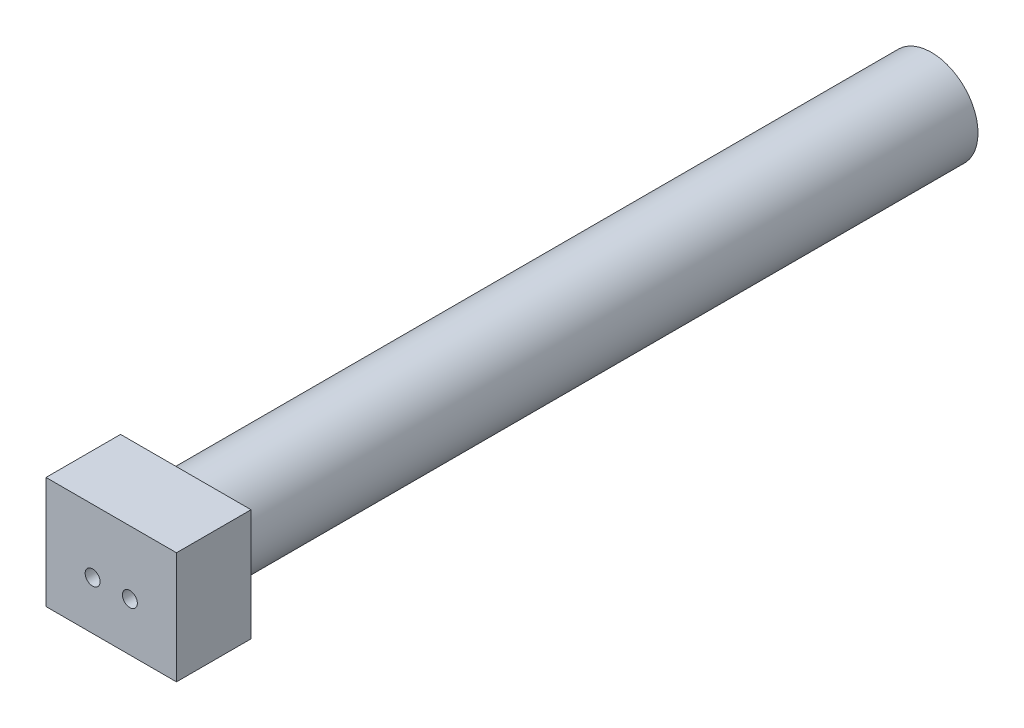
ISO-10303-21;
HEADER;
FILE_DESCRIPTION(('STEP AP214'),'2;1');
FILE_NAME('part.step','',(''),(''),'','','');
FILE_SCHEMA(('AUTOMOTIVE_DESIGN { 1 0 10303 214 1 1 1 1 }'));
ENDSEC;
DATA;
#1=APPLICATION_CONTEXT('core data for automotive mechanical design processes');
#2=APPLICATION_PROTOCOL_DEFINITION('international standard','automotive_design',2000,#1);
#3=PRODUCT_CONTEXT('',#1,'mechanical');
#4=PRODUCT('Part','Part','',(#3));
#5=PRODUCT_RELATED_PRODUCT_CATEGORY('part','',(#4));
#6=PRODUCT_DEFINITION_FORMATION('','',#4);
#7=PRODUCT_DEFINITION_CONTEXT('part definition',#1,'design');
#8=PRODUCT_DEFINITION('design','',#6,#7);
#9=PRODUCT_DEFINITION_SHAPE('','',#8);
#10=(LENGTH_UNIT() NAMED_UNIT(*) SI_UNIT(.MILLI.,.METRE.));
#11=(NAMED_UNIT(*) PLANE_ANGLE_UNIT() SI_UNIT($,.RADIAN.));
#12=(NAMED_UNIT(*) SI_UNIT($,.STERADIAN.) SOLID_ANGLE_UNIT());
#13=UNCERTAINTY_MEASURE_WITH_UNIT(LENGTH_MEASURE(1.E-05),#10,'distance_accuracy_value','');
#14=(GEOMETRIC_REPRESENTATION_CONTEXT(3) GLOBAL_UNCERTAINTY_ASSIGNED_CONTEXT((#13)) GLOBAL_UNIT_ASSIGNED_CONTEXT((#10,
#11,#12)) REPRESENTATION_CONTEXT('',''));
#15=CARTESIAN_POINT('',(0.,0.,0.));
#16=DIRECTION('',(0.,0.,1.));
#17=DIRECTION('',(1.,0.,0.));
#18=AXIS2_PLACEMENT_3D('',#15,#16,#17);
#19=CARTESIAN_POINT('',(0.,0.,0.));
#20=DIRECTION('',(0.,0.,1.));
#21=DIRECTION('',(1.,0.,0.));
#22=AXIS2_PLACEMENT_3D('',#19,#20,#21);
#23=PLANE('',#22);
#24=CARTESIAN_POINT('',(0.,0.,0.));
#25=DIRECTION('',(0.,0.,1.));
#26=DIRECTION('',(1.,0.,0.));
#27=AXIS2_PLACEMENT_3D('',#24,#25,#26);
#28=CIRCLE('',#27,12.5);
#29=CARTESIAN_POINT('',(12.5,0.,0.));
#30=VERTEX_POINT('',#29);
#31=EDGE_CURVE('E38',#30,#30,#28,.T.);
#32=ORIENTED_EDGE('',*,*,#31,.F.);
#33=EDGE_LOOP('',(#32));
#34=FACE_BOUND('',#33,.T.);
#35=CARTESIAN_POINT('',(0.,0.,0.));
#36=DIRECTION('',(0.,0.,1.));
#37=DIRECTION('',(1.,0.,0.));
#38=AXIS2_PLACEMENT_3D('',#35,#36,#37);
#39=CIRCLE('',#38,8.);
#40=CARTESIAN_POINT('',(8.,0.,0.));
#41=VERTEX_POINT('',#40);
#42=EDGE_CURVE('E115',#41,#41,#39,.T.);
#43=ORIENTED_EDGE('',*,*,#42,.T.);
#44=EDGE_LOOP('',(#43));
#45=FACE_BOUND('',#44,.T.);
#46=ADVANCED_FACE('F34',(#34,#45),#23,.F.);
#47=CARTESIAN_POINT('',(0.,0.,200.));
#48=DIRECTION('',(0.,0.,-1.));
#49=DIRECTION('',(-1.,0.,0.));
#50=AXIS2_PLACEMENT_3D('',#47,#48,#49);
#51=CYLINDRICAL_SURFACE('',#50,12.5);
#52=CARTESIAN_POINT('',(0.,0.,200.));
#53=DIRECTION('',(0.,0.,1.));
#54=DIRECTION('',(1.,0.,0.));
#55=AXIS2_PLACEMENT_3D('',#52,#53,#54);
#56=CIRCLE('',#55,12.5);
#57=CARTESIAN_POINT('',(12.5,0.,200.));
#58=VERTEX_POINT('',#57);
#59=EDGE_CURVE('E11',#58,#58,#56,.T.);
#60=ORIENTED_EDGE('',*,*,#59,.F.);
#61=EDGE_LOOP('',(#60));
#62=FACE_BOUND('',#61,.T.);
#63=ORIENTED_EDGE('',*,*,#31,.T.);
#64=EDGE_LOOP('',(#63));
#65=FACE_BOUND('',#64,.T.);
#66=ADVANCED_FACE('F36',(#62,#65),#51,.T.);
#67=CARTESIAN_POINT('',(0.,0.,200.));
#68=DIRECTION('',(0.,0.,-1.));
#69=DIRECTION('',(-1.,0.,0.));
#70=AXIS2_PLACEMENT_3D('',#67,#68,#69);
#71=CYLINDRICAL_SURFACE('',#70,8.);
#72=CARTESIAN_POINT('',(0.,0.,200.));
#73=DIRECTION('',(0.,0.,1.));
#74=DIRECTION('',(1.,0.,0.));
#75=AXIS2_PLACEMENT_3D('',#72,#73,#74);
#76=CIRCLE('',#75,8.);
#77=CARTESIAN_POINT('',(8.,0.,200.));
#78=VERTEX_POINT('',#77);
#79=EDGE_CURVE('E112',#78,#78,#76,.T.);
#80=ORIENTED_EDGE('',*,*,#79,.T.);
#81=EDGE_LOOP('',(#80));
#82=FACE_BOUND('',#81,.T.);
#83=ORIENTED_EDGE('',*,*,#42,.F.);
#84=EDGE_LOOP('',(#83));
#85=FACE_BOUND('',#84,.T.);
#86=ADVANCED_FACE('F127',(#82,#85),#71,.F.);
#87=CARTESIAN_POINT('',(0.,0.,200.));
#88=DIRECTION('',(0.,0.,1.));
#89=DIRECTION('',(1.,0.,0.));
#90=AXIS2_PLACEMENT_3D('',#87,#88,#89);
#91=PLANE('',#90);
#92=CARTESIAN_POINT('',(5.,-2.,200.));
#93=DIRECTION('',(0.,0.,1.));
#94=DIRECTION('',(1.,0.,0.));
#95=AXIS2_PLACEMENT_3D('',#92,#93,#94);
#96=CIRCLE('',#95,2.);
#97=CARTESIAN_POINT('',(7.,-2.,200.));
#98=VERTEX_POINT('',#97);
#99=EDGE_CURVE('E105',#98,#98,#96,.T.);
#100=ORIENTED_EDGE('',*,*,#99,.T.);
#101=EDGE_LOOP('',(#100));
#102=FACE_BOUND('',#101,.T.);
#103=CARTESIAN_POINT('',(-5.,-2.,200.));
#104=DIRECTION('',(0.,0.,1.));
#105=DIRECTION('',(1.,0.,0.));
#106=AXIS2_PLACEMENT_3D('',#103,#104,#105);
#107=CIRCLE('',#106,2.);
#108=CARTESIAN_POINT('',(-3.,-2.,200.));
#109=VERTEX_POINT('',#108);
#110=EDGE_CURVE('E167',#109,#109,#107,.T.);
#111=ORIENTED_EDGE('',*,*,#110,.T.);
#112=EDGE_LOOP('',(#111));
#113=FACE_BOUND('',#112,.T.);
#114=ORIENTED_EDGE('',*,*,#79,.F.);
#115=EDGE_LOOP('',(#114));
#116=FACE_BOUND('',#115,.T.);
#117=ADVANCED_FACE('F132',(#102,#113,#116),#91,.F.);
#118=CARTESIAN_POINT('',(-17.5,15.,220.));
#119=DIRECTION('',(1.,0.,0.));
#120=DIRECTION('',(0.,1.,0.));
#121=AXIS2_PLACEMENT_3D('',#118,#119,#120);
#122=PLANE('',#121);
#123=DIRECTION('',(0.,-1.,0.));
#124=VECTOR('',#123,1.);
#125=CARTESIAN_POINT('',(-17.5,15.,200.));
#126=LINE('',#125,#124);
#127=CARTESIAN_POINT('',(-17.5,15.,200.));
#128=VERTEX_POINT('',#127);
#129=CARTESIAN_POINT('',(-17.5,-15.,200.));
#130=VERTEX_POINT('',#129);
#131=EDGE_CURVE('E102',#128,#130,#126,.T.);
#132=ORIENTED_EDGE('',*,*,#131,.T.);
#133=DIRECTION('',(0.,0.,-1.));
#134=VECTOR('',#133,1.);
#135=CARTESIAN_POINT('',(-17.5,-15.,220.));
#136=LINE('',#135,#134);
#137=CARTESIAN_POINT('',(-17.5,-15.,220.));
#138=VERTEX_POINT('',#137);
#139=EDGE_CURVE('E93',#138,#130,#136,.T.);
#140=ORIENTED_EDGE('',*,*,#139,.F.);
#141=DIRECTION('',(0.,-1.,0.));
#142=VECTOR('',#141,1.);
#143=CARTESIAN_POINT('',(-17.5,15.,220.));
#144=LINE('',#143,#142);
#145=CARTESIAN_POINT('',(-17.5,15.,220.));
#146=VERTEX_POINT('',#145);
#147=EDGE_CURVE('E87',#146,#138,#144,.T.);
#148=ORIENTED_EDGE('',*,*,#147,.F.);
#149=DIRECTION('',(0.,0.,-1.));
#150=VECTOR('',#149,1.);
#151=CARTESIAN_POINT('',(-17.5,15.,220.));
#152=LINE('',#151,#150);
#153=EDGE_CURVE('E98',#146,#128,#152,.T.);
#154=ORIENTED_EDGE('',*,*,#153,.T.);
#155=EDGE_LOOP('',(#132,#140,#148,#154));
#156=FACE_BOUND('',#155,.T.);
#157=ADVANCED_FACE('F134',(#156),#122,.F.);
#158=CARTESIAN_POINT('',(-17.5,-15.,220.));
#159=DIRECTION('',(0.,1.,0.));
#160=DIRECTION('',(0.,0.,1.));
#161=AXIS2_PLACEMENT_3D('',#158,#159,#160);
#162=PLANE('',#161);
#163=DIRECTION('',(1.,0.,0.));
#164=VECTOR('',#163,1.);
#165=CARTESIAN_POINT('',(-17.5,-15.,200.));
#166=LINE('',#165,#164);
#167=CARTESIAN_POINT('',(17.5,-15.,200.));
#168=VERTEX_POINT('',#167);
#169=EDGE_CURVE('E92',#130,#168,#166,.T.);
#170=ORIENTED_EDGE('',*,*,#169,.T.);
#171=DIRECTION('',(0.,0.,-1.));
#172=VECTOR('',#171,1.);
#173=CARTESIAN_POINT('',(17.5,-15.,220.));
#174=LINE('',#173,#172);
#175=CARTESIAN_POINT('',(17.5,-15.,220.));
#176=VERTEX_POINT('',#175);
#177=EDGE_CURVE('E90',#176,#168,#174,.T.);
#178=ORIENTED_EDGE('',*,*,#177,.F.);
#179=DIRECTION('',(1.,0.,0.));
#180=VECTOR('',#179,1.);
#181=CARTESIAN_POINT('',(-17.5,-15.,220.));
#182=LINE('',#181,#180);
#183=EDGE_CURVE('E82',#138,#176,#182,.T.);
#184=ORIENTED_EDGE('',*,*,#183,.F.);
#185=ORIENTED_EDGE('',*,*,#139,.T.);
#186=EDGE_LOOP('',(#170,#178,#184,#185));
#187=FACE_BOUND('',#186,.T.);
#188=ADVANCED_FACE('F91',(#187),#162,.F.);
#189=CARTESIAN_POINT('',(17.5,15.,220.));
#190=DIRECTION('',(-1.,0.,0.));
#191=DIRECTION('',(0.,-1.,0.));
#192=AXIS2_PLACEMENT_3D('',#189,#190,#191);
#193=PLANE('',#192);
#194=DIRECTION('',(0.,1.,0.));
#195=VECTOR('',#194,1.);
#196=CARTESIAN_POINT('',(17.5,15.,200.));
#197=LINE('',#196,#195);
#198=CARTESIAN_POINT('',(17.5,15.,200.));
#199=VERTEX_POINT('',#198);
#200=EDGE_CURVE('E68',#168,#199,#197,.T.);
#201=ORIENTED_EDGE('',*,*,#200,.T.);
#202=DIRECTION('',(0.,0.,-1.));
#203=VECTOR('',#202,1.);
#204=CARTESIAN_POINT('',(17.5,15.,220.));
#205=LINE('',#204,#203);
#206=CARTESIAN_POINT('',(17.5,15.,220.));
#207=VERTEX_POINT('',#206);
#208=EDGE_CURVE('E94',#207,#199,#205,.T.);
#209=ORIENTED_EDGE('',*,*,#208,.F.);
#210=DIRECTION('',(0.,1.,0.));
#211=VECTOR('',#210,1.);
#212=CARTESIAN_POINT('',(17.5,15.,220.));
#213=LINE('',#212,#211);
#214=EDGE_CURVE('E85',#176,#207,#213,.T.);
#215=ORIENTED_EDGE('',*,*,#214,.F.);
#216=ORIENTED_EDGE('',*,*,#177,.T.);
#217=EDGE_LOOP('',(#201,#209,#215,#216));
#218=FACE_BOUND('',#217,.T.);
#219=ADVANCED_FACE('F96',(#218),#193,.F.);
#220=CARTESIAN_POINT('',(-17.5,15.,220.));
#221=DIRECTION('',(0.,-1.,0.));
#222=DIRECTION('',(0.,0.,-1.));
#223=AXIS2_PLACEMENT_3D('',#220,#221,#222);
#224=PLANE('',#223);
#225=DIRECTION('',(-1.,0.,0.));
#226=VECTOR('',#225,1.);
#227=CARTESIAN_POINT('',(-17.5,15.,200.));
#228=LINE('',#227,#226);
#229=EDGE_CURVE('E74',#199,#128,#228,.T.);
#230=ORIENTED_EDGE('',*,*,#229,.T.);
#231=ORIENTED_EDGE('',*,*,#153,.F.);
#232=DIRECTION('',(-1.,0.,0.));
#233=VECTOR('',#232,1.);
#234=CARTESIAN_POINT('',(-17.5,15.,220.));
#235=LINE('',#234,#233);
#236=EDGE_CURVE('E51',#207,#146,#235,.T.);
#237=ORIENTED_EDGE('',*,*,#236,.F.);
#238=ORIENTED_EDGE('',*,*,#208,.T.);
#239=EDGE_LOOP('',(#230,#231,#237,#238));
#240=FACE_BOUND('',#239,.T.);
#241=ADVANCED_FACE('F142',(#240),#224,.F.);
#242=CARTESIAN_POINT('',(0.,0.,220.));
#243=DIRECTION('',(0.,0.,1.));
#244=DIRECTION('',(1.,0.,0.));
#245=AXIS2_PLACEMENT_3D('',#242,#243,#244);
#246=PLANE('',#245);
#247=CARTESIAN_POINT('',(5.,-2.,220.));
#248=DIRECTION('',(0.,0.,1.));
#249=DIRECTION('',(1.,0.,0.));
#250=AXIS2_PLACEMENT_3D('',#247,#248,#249);
#251=CIRCLE('',#250,2.);
#252=CARTESIAN_POINT('',(7.,-2.,220.));
#253=VERTEX_POINT('',#252);
#254=EDGE_CURVE('E166',#253,#253,#251,.T.);
#255=ORIENTED_EDGE('',*,*,#254,.F.);
#256=EDGE_LOOP('',(#255));
#257=FACE_BOUND('',#256,.T.);
#258=CARTESIAN_POINT('',(-5.,-2.,220.));
#259=DIRECTION('',(0.,0.,1.));
#260=DIRECTION('',(1.,0.,0.));
#261=AXIS2_PLACEMENT_3D('',#258,#259,#260);
#262=CIRCLE('',#261,2.);
#263=CARTESIAN_POINT('',(-3.,-2.,220.));
#264=VERTEX_POINT('',#263);
#265=EDGE_CURVE('E171',#264,#264,#262,.T.);
#266=ORIENTED_EDGE('',*,*,#265,.F.);
#267=EDGE_LOOP('',(#266));
#268=FACE_BOUND('',#267,.T.);
#269=ORIENTED_EDGE('',*,*,#147,.T.);
#270=ORIENTED_EDGE('',*,*,#183,.T.);
#271=ORIENTED_EDGE('',*,*,#214,.T.);
#272=ORIENTED_EDGE('',*,*,#236,.T.);
#273=EDGE_LOOP('',(#269,#270,#271,#272));
#274=FACE_BOUND('',#273,.T.);
#275=ADVANCED_FACE('F83',(#257,#268,#274),#246,.T.);
#276=ORIENTED_EDGE('',*,*,#59,.T.);
#277=EDGE_LOOP('',(#276));
#278=FACE_BOUND('',#277,.T.);
#279=ORIENTED_EDGE('',*,*,#131,.F.);
#280=ORIENTED_EDGE('',*,*,#229,.F.);
#281=ORIENTED_EDGE('',*,*,#200,.F.);
#282=ORIENTED_EDGE('',*,*,#169,.F.);
#283=EDGE_LOOP('',(#279,#280,#281,#282));
#284=FACE_BOUND('',#283,.T.);
#285=ADVANCED_FACE('F145',(#278,#284),#91,.F.);
#286=CARTESIAN_POINT('',(-5.,-2.,200.));
#287=DIRECTION('',(0.,0.,1.));
#288=DIRECTION('',(1.,0.,0.));
#289=AXIS2_PLACEMENT_3D('',#286,#287,#288);
#290=CYLINDRICAL_SURFACE('',#289,2.);
#291=ORIENTED_EDGE('',*,*,#110,.F.);
#292=EDGE_LOOP('',(#291));
#293=FACE_BOUND('',#292,.T.);
#294=ORIENTED_EDGE('',*,*,#265,.T.);
#295=EDGE_LOOP('',(#294));
#296=FACE_BOUND('',#295,.T.);
#297=ADVANCED_FACE('F148',(#293,#296),#290,.F.);
#298=CARTESIAN_POINT('',(5.,-2.,200.));
#299=DIRECTION('',(0.,0.,1.));
#300=DIRECTION('',(1.,0.,0.));
#301=AXIS2_PLACEMENT_3D('',#298,#299,#300);
#302=CYLINDRICAL_SURFACE('',#301,2.);
#303=ORIENTED_EDGE('',*,*,#99,.F.);
#304=EDGE_LOOP('',(#303));
#305=FACE_BOUND('',#304,.T.);
#306=ORIENTED_EDGE('',*,*,#254,.T.);
#307=EDGE_LOOP('',(#306));
#308=FACE_BOUND('',#307,.T.);
#309=ADVANCED_FACE('F155',(#305,#308),#302,.F.);
#310=CLOSED_SHELL('',(#46,#66,#86,#117,#157,#188,#219,#241,#275,#285,#297,#309));
#311=MANIFOLD_SOLID_BREP('B2',#310);
#312=ADVANCED_BREP_SHAPE_REPRESENTATION('',(#18,#311),#14);
#313=SHAPE_DEFINITION_REPRESENTATION(#9,#312);
ENDSEC;
END-ISO-10303-21;
